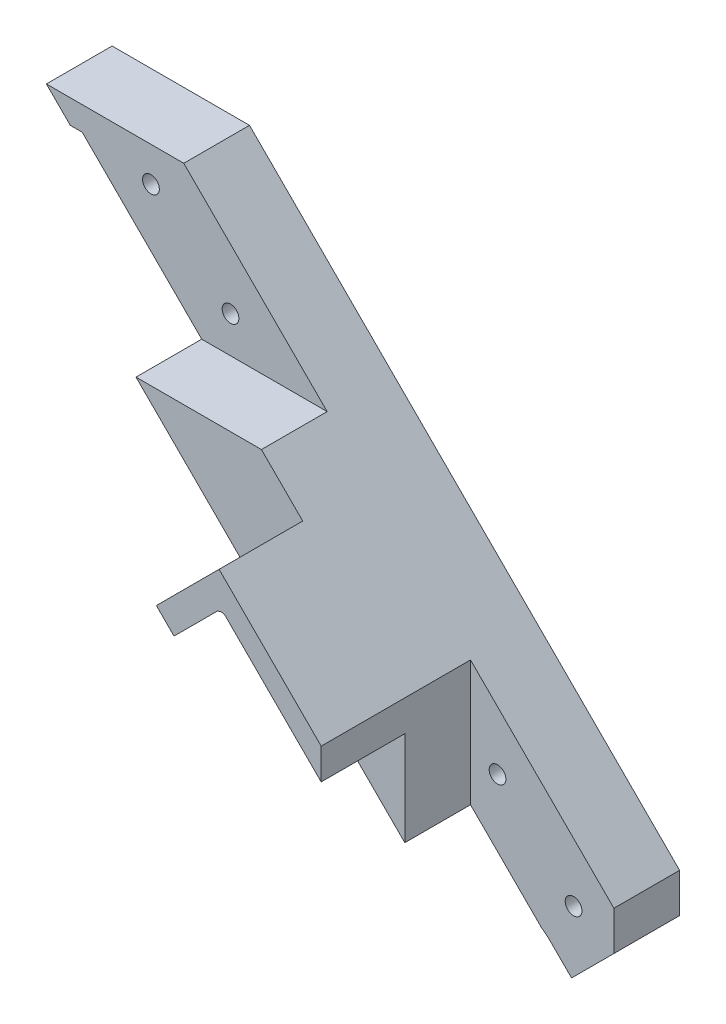
ISO-10303-21;
HEADER;
FILE_DESCRIPTION(('STEP AP214'),'2;1');
FILE_NAME('part.step','',(''),(''),'','','');
FILE_SCHEMA(('AUTOMOTIVE_DESIGN { 1 0 10303 214 1 1 1 1 }'));
ENDSEC;
DATA;
#1=APPLICATION_CONTEXT('core data for automotive mechanical design processes');
#2=APPLICATION_PROTOCOL_DEFINITION('international standard','automotive_design',2000,#1);
#3=PRODUCT_CONTEXT('',#1,'mechanical');
#4=PRODUCT('Part','Part','',(#3));
#5=PRODUCT_RELATED_PRODUCT_CATEGORY('part','',(#4));
#6=PRODUCT_DEFINITION_FORMATION('','',#4);
#7=PRODUCT_DEFINITION_CONTEXT('part definition',#1,'design');
#8=PRODUCT_DEFINITION('design','',#6,#7);
#9=PRODUCT_DEFINITION_SHAPE('','',#8);
#10=(LENGTH_UNIT() NAMED_UNIT(*) SI_UNIT(.MILLI.,.METRE.));
#11=(NAMED_UNIT(*) PLANE_ANGLE_UNIT() SI_UNIT($,.RADIAN.));
#12=(NAMED_UNIT(*) SI_UNIT($,.STERADIAN.) SOLID_ANGLE_UNIT());
#13=UNCERTAINTY_MEASURE_WITH_UNIT(LENGTH_MEASURE(1.E-05),#10,'distance_accuracy_value','');
#14=(GEOMETRIC_REPRESENTATION_CONTEXT(3) GLOBAL_UNCERTAINTY_ASSIGNED_CONTEXT((#13)) GLOBAL_UNIT_ASSIGNED_CONTEXT((#10,
#11,#12)) REPRESENTATION_CONTEXT('',''));
#15=CARTESIAN_POINT('',(0.,0.,0.));
#16=DIRECTION('',(0.,0.,1.));
#17=DIRECTION('',(1.,0.,0.));
#18=AXIS2_PLACEMENT_3D('',#15,#16,#17);
#19=CARTESIAN_POINT('',(-91.49539816056,-19.78969485403,41.));
#20=DIRECTION('',(0.,0.,1.));
#21=DIRECTION('',(1.,0.,0.));
#22=AXIS2_PLACEMENT_3D('',#19,#20,#21);
#23=PLANE('',#22);
#24=CARTESIAN_POINT('',(-91.49539816056,-19.78969485403,41.));
#25=DIRECTION('',(0.,0.,1.));
#26=DIRECTION('',(1.,0.,0.));
#27=AXIS2_PLACEMENT_3D('',#24,#25,#26);
#28=CIRCLE('',#27,1.4);
#29=CARTESIAN_POINT('',(-90.09539816056,-19.78969485403,41.));
#30=VERTEX_POINT('',#29);
#31=EDGE_CURVE('E9',#30,#30,#28,.T.);
#32=ORIENTED_EDGE('',*,*,#31,.T.);
#33=EDGE_LOOP('',(#32));
#34=FACE_BOUND('',#33,.T.);
#35=ADVANCED_FACE('F14',(#34),#23,.T.);
#36=CARTESIAN_POINT('',(-78.17647683943,-31.89780514596,41.));
#37=DIRECTION('',(0.,0.,1.));
#38=DIRECTION('',(1.,0.,0.));
#39=AXIS2_PLACEMENT_3D('',#36,#37,#38);
#40=PLANE('',#39);
#41=CARTESIAN_POINT('',(-78.17647683943,-31.89780514596,41.));
#42=DIRECTION('',(0.,0.,1.));
#43=DIRECTION('',(1.,0.,0.));
#44=AXIS2_PLACEMENT_3D('',#41,#42,#43);
#45=CIRCLE('',#44,1.4);
#46=CARTESIAN_POINT('',(-76.77647683943,-31.89780514596,41.));
#47=VERTEX_POINT('',#46);
#48=EDGE_CURVE('E488',#47,#47,#45,.T.);
#49=ORIENTED_EDGE('',*,*,#48,.T.);
#50=EDGE_LOOP('',(#49));
#51=FACE_BOUND('',#50,.T.);
#52=ADVANCED_FACE('F16',(#51),#40,.T.);
#53=CARTESIAN_POINT('',(-33.47902169813,-76.33683094573,41.));
#54=DIRECTION('',(0.,0.,1.));
#55=DIRECTION('',(1.,0.,0.));
#56=AXIS2_PLACEMENT_3D('',#53,#54,#55);
#57=PLANE('',#56);
#58=CARTESIAN_POINT('',(-33.47902169813,-76.33683094573,41.));
#59=DIRECTION('',(0.,0.,1.));
#60=DIRECTION('',(1.,0.,0.));
#61=AXIS2_PLACEMENT_3D('',#58,#59,#60);
#62=CIRCLE('',#61,1.4);
#63=CARTESIAN_POINT('',(-32.07902169813,-76.33683094573,41.));
#64=VERTEX_POINT('',#63);
#65=EDGE_CURVE('E305',#64,#64,#62,.T.);
#66=ORIENTED_EDGE('',*,*,#65,.T.);
#67=EDGE_LOOP('',(#66));
#68=FACE_BOUND('',#67,.T.);
#69=ADVANCED_FACE('F530',(#68),#57,.T.);
#70=CARTESIAN_POINT('',(-20.75109963677,-89.06475300708,41.));
#71=DIRECTION('',(0.,0.,1.));
#72=DIRECTION('',(1.,0.,0.));
#73=AXIS2_PLACEMENT_3D('',#70,#71,#72);
#74=PLANE('',#73);
#75=CARTESIAN_POINT('',(-20.75109963677,-89.06475300708,41.));
#76=DIRECTION('',(0.,0.,1.));
#77=DIRECTION('',(1.,0.,0.));
#78=AXIS2_PLACEMENT_3D('',#75,#76,#77);
#79=CIRCLE('',#78,1.4);
#80=CARTESIAN_POINT('',(-19.35109963677,-89.06475300708,41.));
#81=VERTEX_POINT('',#80);
#82=EDGE_CURVE('E430',#81,#81,#79,.T.);
#83=ORIENTED_EDGE('',*,*,#82,.T.);
#84=EDGE_LOOP('',(#83));
#85=FACE_BOUND('',#84,.T.);
#86=ADVANCED_FACE('F535',(#85),#74,.T.);
#87=CARTESIAN_POINT('',(-55.43717164502,-59.67981233214,43.9));
#88=DIRECTION('',(0.,0.,1.));
#89=DIRECTION('',(1.,0.,0.));
#90=AXIS2_PLACEMENT_3D('',#87,#88,#89);
#91=PLANE('',#90);
#92=CARTESIAN_POINT('',(-55.43717164502,-59.67981233214,43.9));
#93=DIRECTION('',(0.,0.,1.));
#94=DIRECTION('',(1.,0.,0.));
#95=AXIS2_PLACEMENT_3D('',#92,#93,#94);
#96=CIRCLE('',#95,1.7);
#97=CARTESIAN_POINT('',(-53.73717164502,-59.67981233214,43.9));
#98=VERTEX_POINT('',#97);
#99=EDGE_CURVE('E393',#98,#98,#96,.T.);
#100=ORIENTED_EDGE('',*,*,#99,.T.);
#101=EDGE_LOOP('',(#100));
#102=FACE_BOUND('',#101,.T.);
#103=CARTESIAN_POINT('',(-55.43717164502,-59.67981233214,43.9));
#104=DIRECTION('',(0.,0.,1.));
#105=DIRECTION('',(1.,0.,0.));
#106=AXIS2_PLACEMENT_3D('',#103,#104,#105);
#107=CIRCLE('',#106,3.6);
#108=CARTESIAN_POINT('',(-51.83717164502,-59.67981233214,43.9));
#109=VERTEX_POINT('',#108);
#110=EDGE_CURVE('E489',#109,#109,#107,.T.);
#111=ORIENTED_EDGE('',*,*,#110,.F.);
#112=EDGE_LOOP('',(#111));
#113=FACE_BOUND('',#112,.T.);
#114=ADVANCED_FACE('F539',(#102,#113),#91,.F.);
#115=CARTESIAN_POINT('',(-47.30544366138,-67.81154031579,43.9));
#116=DIRECTION('',(0.,0.,1.));
#117=DIRECTION('',(1.,0.,0.));
#118=AXIS2_PLACEMENT_3D('',#115,#116,#117);
#119=PLANE('',#118);
#120=CARTESIAN_POINT('',(-47.30544366138,-67.81154031579,43.9));
#121=DIRECTION('',(0.,0.,1.));
#122=DIRECTION('',(1.,0.,0.));
#123=AXIS2_PLACEMENT_3D('',#120,#121,#122);
#124=CIRCLE('',#123,1.7);
#125=CARTESIAN_POINT('',(-45.60544366138,-67.81154031579,43.9));
#126=VERTEX_POINT('',#125);
#127=EDGE_CURVE('E394',#126,#126,#124,.T.);
#128=ORIENTED_EDGE('',*,*,#127,.T.);
#129=EDGE_LOOP('',(#128));
#130=FACE_BOUND('',#129,.T.);
#131=CARTESIAN_POINT('',(-47.30544366138,-67.81154031579,43.9));
#132=DIRECTION('',(0.,0.,1.));
#133=DIRECTION('',(1.,0.,0.));
#134=AXIS2_PLACEMENT_3D('',#131,#132,#133);
#135=CIRCLE('',#134,3.6);
#136=CARTESIAN_POINT('',(-43.70544366138,-67.81154031579,43.9));
#137=VERTEX_POINT('',#136);
#138=EDGE_CURVE('E337',#137,#137,#135,.T.);
#139=ORIENTED_EDGE('',*,*,#138,.F.);
#140=EDGE_LOOP('',(#139));
#141=FACE_BOUND('',#140,.T.);
#142=ADVANCED_FACE('F541',(#130,#141),#119,.F.);
#143=CARTESIAN_POINT('',(-91.49539816056,-19.78969485403,41.));
#144=DIRECTION('',(0.,0.,1.));
#145=DIRECTION('',(1.,0.,0.));
#146=AXIS2_PLACEMENT_3D('',#143,#144,#145);
#147=CYLINDRICAL_SURFACE('',#146,1.4);
#148=DIRECTION('',(0.,0.,1.));
#149=VECTOR('',#148,1.);
#150=CARTESIAN_POINT('',(-90.09539816056,-19.78969485403,41.));
#151=LINE('',#150,#149);
#152=CARTESIAN_POINT('',(-90.09539816056,-19.78969485403,51.));
#153=VERTEX_POINT('',#152);
#154=EDGE_CURVE('E25',#30,#153,#151,.T.);
#155=ORIENTED_EDGE('',*,*,#154,.F.);
#156=ORIENTED_EDGE('',*,*,#31,.F.);
#157=ORIENTED_EDGE('',*,*,#154,.T.);
#158=CARTESIAN_POINT('',(-91.49539816056,-19.78969485403,51.));
#159=DIRECTION('',(0.,0.,1.));
#160=DIRECTION('',(1.,0.,0.));
#161=AXIS2_PLACEMENT_3D('',#158,#159,#160);
#162=CIRCLE('',#161,1.4);
#163=EDGE_CURVE('E629',#153,#153,#162,.T.);
#164=ORIENTED_EDGE('',*,*,#163,.T.);
#165=EDGE_LOOP('',(#155,#156,#157,#164));
#166=FACE_BOUND('',#165,.T.);
#167=ADVANCED_FACE('F544',(#166),#147,.F.);
#168=CARTESIAN_POINT('',(-78.17647683943,-31.89780514596,41.));
#169=DIRECTION('',(0.,0.,1.));
#170=DIRECTION('',(1.,0.,0.));
#171=AXIS2_PLACEMENT_3D('',#168,#169,#170);
#172=CYLINDRICAL_SURFACE('',#171,1.4);
#173=DIRECTION('',(0.,0.,1.));
#174=VECTOR('',#173,1.);
#175=CARTESIAN_POINT('',(-76.77647683943,-31.89780514596,41.));
#176=LINE('',#175,#174);
#177=CARTESIAN_POINT('',(-76.77647683943,-31.89780514596,51.));
#178=VERTEX_POINT('',#177);
#179=EDGE_CURVE('E485',#47,#178,#176,.T.);
#180=ORIENTED_EDGE('',*,*,#179,.F.);
#181=ORIENTED_EDGE('',*,*,#48,.F.);
#182=ORIENTED_EDGE('',*,*,#179,.T.);
#183=CARTESIAN_POINT('',(-78.17647683943,-31.89780514596,51.));
#184=DIRECTION('',(0.,0.,1.));
#185=DIRECTION('',(1.,0.,0.));
#186=AXIS2_PLACEMENT_3D('',#183,#184,#185);
#187=CIRCLE('',#186,1.4);
#188=EDGE_CURVE('E315',#178,#178,#187,.T.);
#189=ORIENTED_EDGE('',*,*,#188,.T.);
#190=EDGE_LOOP('',(#180,#181,#182,#189));
#191=FACE_BOUND('',#190,.T.);
#192=ADVANCED_FACE('F546',(#191),#172,.F.);
#193=CARTESIAN_POINT('',(-55.43717164502,-59.67981233214,39.9));
#194=DIRECTION('',(0.,0.,1.));
#195=DIRECTION('',(1.,0.,0.));
#196=AXIS2_PLACEMENT_3D('',#193,#194,#195);
#197=CYLINDRICAL_SURFACE('',#196,3.6);
#198=CARTESIAN_POINT('',(-55.43717164502,-59.67981233214,40.));
#199=DIRECTION('',(0.,0.,1.));
#200=DIRECTION('',(1.,0.,0.));
#201=AXIS2_PLACEMENT_3D('',#198,#199,#200);
#202=CIRCLE('',#201,3.6);
#203=CARTESIAN_POINT('',(-51.83717164502,-59.67981233214,40.));
#204=VERTEX_POINT('',#203);
#205=EDGE_CURVE('E617',#204,#204,#202,.T.);
#206=ORIENTED_EDGE('',*,*,#205,.F.);
#207=DIRECTION('',(0.,0.,1.));
#208=VECTOR('',#207,1.);
#209=CARTESIAN_POINT('',(-51.83717164502,-59.67981233214,39.9));
#210=LINE('',#209,#208);
#211=EDGE_CURVE('E340',#204,#109,#210,.T.);
#212=ORIENTED_EDGE('',*,*,#211,.T.);
#213=ORIENTED_EDGE('',*,*,#110,.T.);
#214=ORIENTED_EDGE('',*,*,#211,.F.);
#215=EDGE_LOOP('',(#206,#212,#213,#214));
#216=FACE_BOUND('',#215,.T.);
#217=ADVANCED_FACE('F549',(#216),#197,.F.);
#218=CARTESIAN_POINT('',(-47.30544366138,-67.81154031579,39.9));
#219=DIRECTION('',(0.,0.,1.));
#220=DIRECTION('',(1.,0.,0.));
#221=AXIS2_PLACEMENT_3D('',#218,#219,#220);
#222=CYLINDRICAL_SURFACE('',#221,3.6);
#223=CARTESIAN_POINT('',(-47.30544366138,-67.81154031579,40.));
#224=DIRECTION('',(0.,0.,1.));
#225=DIRECTION('',(1.,0.,0.));
#226=AXIS2_PLACEMENT_3D('',#223,#224,#225);
#227=CIRCLE('',#226,3.6);
#228=CARTESIAN_POINT('',(-43.70544366138,-67.81154031579,40.));
#229=VERTEX_POINT('',#228);
#230=EDGE_CURVE('E625',#229,#229,#227,.T.);
#231=ORIENTED_EDGE('',*,*,#230,.F.);
#232=DIRECTION('',(0.,0.,1.));
#233=VECTOR('',#232,1.);
#234=CARTESIAN_POINT('',(-43.70544366138,-67.81154031579,39.9));
#235=LINE('',#234,#233);
#236=EDGE_CURVE('E304',#229,#137,#235,.T.);
#237=ORIENTED_EDGE('',*,*,#236,.T.);
#238=ORIENTED_EDGE('',*,*,#138,.T.);
#239=ORIENTED_EDGE('',*,*,#236,.F.);
#240=EDGE_LOOP('',(#231,#237,#238,#239));
#241=FACE_BOUND('',#240,.T.);
#242=ADVANCED_FACE('F752',(#241),#222,.F.);
#243=CARTESIAN_POINT('',(-109.,-14.,40.));
#244=DIRECTION('',(0.707106781186548,0.707106781186548,0.));
#245=DIRECTION('',(0.,0.,-1.));
#246=AXIS2_PLACEMENT_3D('',#243,#244,#245);
#247=PLANE('',#246);
#248=DIRECTION('',(0.707106781186548,-0.707106781186548,0.));
#249=VECTOR('',#248,1.);
#250=CARTESIAN_POINT('',(-109.,-14.,40.));
#251=LINE('',#250,#249);
#252=CARTESIAN_POINT('',(-109.,-14.,40.));
#253=VERTEX_POINT('',#252);
#254=CARTESIAN_POINT('',(-105.,-18.,40.));
#255=VERTEX_POINT('',#254);
#256=EDGE_CURVE('E384',#253,#255,#251,.T.);
#257=ORIENTED_EDGE('',*,*,#256,.T.);
#258=DIRECTION('',(0.,0.,1.));
#259=VECTOR('',#258,1.);
#260=CARTESIAN_POINT('',(-105.,-18.,40.));
#261=LINE('',#260,#259);
#262=CARTESIAN_POINT('',(-105.,-18.,51.));
#263=VERTEX_POINT('',#262);
#264=EDGE_CURVE('E318',#255,#263,#261,.T.);
#265=ORIENTED_EDGE('',*,*,#264,.T.);
#266=DIRECTION('',(0.707106781186548,-0.707106781186548,0.));
#267=VECTOR('',#266,1.);
#268=CARTESIAN_POINT('',(-109.,-14.,51.));
#269=LINE('',#268,#267);
#270=CARTESIAN_POINT('',(-109.,-14.,51.));
#271=VERTEX_POINT('',#270);
#272=EDGE_CURVE('E310',#271,#263,#269,.T.);
#273=ORIENTED_EDGE('',*,*,#272,.F.);
#274=DIRECTION('',(0.,0.,1.));
#275=VECTOR('',#274,1.);
#276=CARTESIAN_POINT('',(-109.,-14.,40.));
#277=LINE('',#276,#275);
#278=EDGE_CURVE('E292',#253,#271,#277,.T.);
#279=ORIENTED_EDGE('',*,*,#278,.F.);
#280=EDGE_LOOP('',(#257,#265,#273,#279));
#281=FACE_BOUND('',#280,.T.);
#282=ADVANCED_FACE('F317',(#281),#247,.F.);
#283=CARTESIAN_POINT('',(-86.,-14.,40.));
#284=DIRECTION('',(0.,-1.,0.));
#285=DIRECTION('',(0.,0.,-1.));
#286=AXIS2_PLACEMENT_3D('',#283,#284,#285);
#287=PLANE('',#286);
#288=DIRECTION('',(-1.,0.,0.));
#289=VECTOR('',#288,1.);
#290=CARTESIAN_POINT('',(-86.,-14.,40.));
#291=LINE('',#290,#289);
#292=CARTESIAN_POINT('',(-86.,-14.,40.));
#293=VERTEX_POINT('',#292);
#294=EDGE_CURVE('E298',#293,#253,#291,.T.);
#295=ORIENTED_EDGE('',*,*,#294,.T.);
#296=ORIENTED_EDGE('',*,*,#278,.T.);
#297=DIRECTION('',(-1.,0.,0.));
#298=VECTOR('',#297,1.);
#299=CARTESIAN_POINT('',(-86.,-14.,51.));
#300=LINE('',#299,#298);
#301=CARTESIAN_POINT('',(-86.,-14.,51.));
#302=VERTEX_POINT('',#301);
#303=EDGE_CURVE('E295',#302,#271,#300,.T.);
#304=ORIENTED_EDGE('',*,*,#303,.F.);
#305=DIRECTION('',(0.,0.,1.));
#306=VECTOR('',#305,1.);
#307=CARTESIAN_POINT('',(-86.,-14.,40.));
#308=LINE('',#307,#306);
#309=EDGE_CURVE('E286',#293,#302,#308,.T.);
#310=ORIENTED_EDGE('',*,*,#309,.F.);
#311=EDGE_LOOP('',(#295,#296,#304,#310));
#312=FACE_BOUND('',#311,.T.);
#313=ADVANCED_FACE('F294',(#312),#287,.F.);
#314=CARTESIAN_POINT('',(-33.47902169813,-76.33683094573,41.));
#315=DIRECTION('',(0.,0.,1.));
#316=DIRECTION('',(1.,0.,0.));
#317=AXIS2_PLACEMENT_3D('',#314,#315,#316);
#318=CYLINDRICAL_SURFACE('',#317,1.4);
#319=DIRECTION('',(0.,0.,1.));
#320=VECTOR('',#319,1.);
#321=CARTESIAN_POINT('',(-32.07902169813,-76.33683094573,41.));
#322=LINE('',#321,#320);
#323=CARTESIAN_POINT('',(-32.07902169813,-76.33683094573,51.));
#324=VERTEX_POINT('',#323);
#325=EDGE_CURVE('E484',#64,#324,#322,.T.);
#326=ORIENTED_EDGE('',*,*,#325,.F.);
#327=ORIENTED_EDGE('',*,*,#65,.F.);
#328=ORIENTED_EDGE('',*,*,#325,.T.);
#329=CARTESIAN_POINT('',(-33.47902169813,-76.33683094573,51.));
#330=DIRECTION('',(0.,0.,1.));
#331=DIRECTION('',(1.,0.,0.));
#332=AXIS2_PLACEMENT_3D('',#329,#330,#331);
#333=CIRCLE('',#332,1.4);
#334=EDGE_CURVE('E470',#324,#324,#333,.T.);
#335=ORIENTED_EDGE('',*,*,#334,.T.);
#336=EDGE_LOOP('',(#326,#327,#328,#335));
#337=FACE_BOUND('',#336,.T.);
#338=ADVANCED_FACE('F555',(#337),#318,.F.);
#339=CARTESIAN_POINT('',(-20.75109963677,-89.06475300708,41.));
#340=DIRECTION('',(0.,0.,1.));
#341=DIRECTION('',(1.,0.,0.));
#342=AXIS2_PLACEMENT_3D('',#339,#340,#341);
#343=CYLINDRICAL_SURFACE('',#342,1.4);
#344=DIRECTION('',(0.,0.,1.));
#345=VECTOR('',#344,1.);
#346=CARTESIAN_POINT('',(-19.35109963677,-89.06475300708,41.));
#347=LINE('',#346,#345);
#348=CARTESIAN_POINT('',(-19.35109963677,-89.06475300708,51.));
#349=VERTEX_POINT('',#348);
#350=EDGE_CURVE('E427',#81,#349,#347,.T.);
#351=ORIENTED_EDGE('',*,*,#350,.F.);
#352=ORIENTED_EDGE('',*,*,#82,.F.);
#353=ORIENTED_EDGE('',*,*,#350,.T.);
#354=CARTESIAN_POINT('',(-20.75109963677,-89.06475300708,51.));
#355=DIRECTION('',(0.,0.,1.));
#356=DIRECTION('',(1.,0.,0.));
#357=AXIS2_PLACEMENT_3D('',#354,#355,#356);
#358=CIRCLE('',#357,1.4);
#359=EDGE_CURVE('E466',#349,#349,#358,.T.);
#360=ORIENTED_EDGE('',*,*,#359,.T.);
#361=EDGE_LOOP('',(#351,#352,#353,#360));
#362=FACE_BOUND('',#361,.T.);
#363=ADVANCED_FACE('F558',(#362),#343,.F.);
#364=CARTESIAN_POINT('',(-25.12003021328,-95.62906507217,40.));
#365=DIRECTION('',(0.706795959357822,0.707417466447822,0.));
#366=DIRECTION('',(0.,0.,-1.));
#367=AXIS2_PLACEMENT_3D('',#364,#365,#366);
#368=PLANE('',#367);
#369=DIRECTION('',(0.707417466447822,-0.706795959357822,0.));
#370=VECTOR('',#369,1.);
#371=CARTESIAN_POINT('',(-25.12003021328,-95.62906507217,40.));
#372=LINE('',#371,#370);
#373=CARTESIAN_POINT('',(-25.12003021328,-95.62906507217,40.));
#374=VERTEX_POINT('',#373);
#375=CARTESIAN_POINT('',(-21.08918523767,-99.65636871773,40.));
#376=VERTEX_POINT('',#375);
#377=EDGE_CURVE('E426',#374,#376,#372,.T.);
#378=ORIENTED_EDGE('',*,*,#377,.T.);
#379=DIRECTION('',(0.,0.,1.));
#380=VECTOR('',#379,1.);
#381=CARTESIAN_POINT('',(-21.08918523767,-99.65636871773,40.));
#382=LINE('',#381,#380);
#383=CARTESIAN_POINT('',(-21.08918523767,-99.65636871773,51.));
#384=VERTEX_POINT('',#383);
#385=EDGE_CURVE('E234',#376,#384,#382,.T.);
#386=ORIENTED_EDGE('',*,*,#385,.T.);
#387=DIRECTION('',(0.707417466447822,-0.706795959357822,0.));
#388=VECTOR('',#387,1.);
#389=CARTESIAN_POINT('',(-25.12003021328,-95.62906507217,51.));
#390=LINE('',#389,#388);
#391=CARTESIAN_POINT('',(-25.12003021328,-95.62906507217,51.));
#392=VERTEX_POINT('',#391);
#393=EDGE_CURVE('E385',#392,#384,#390,.T.);
#394=ORIENTED_EDGE('',*,*,#393,.F.);
#395=DIRECTION('',(0.,0.,1.));
#396=VECTOR('',#395,1.);
#397=CARTESIAN_POINT('',(-25.12003021328,-95.62906507217,40.));
#398=LINE('',#397,#396);
#399=EDGE_CURVE('E245',#374,#392,#398,.T.);
#400=ORIENTED_EDGE('',*,*,#399,.F.);
#401=EDGE_LOOP('',(#378,#386,#394,#400));
#402=FACE_BOUND('',#401,.T.);
#403=ADVANCED_FACE('F566',(#402),#368,.F.);
#404=CARTESIAN_POINT('',(-21.08918523767,-99.65636871773,40.));
#405=DIRECTION('',(-0.707029670829544,0.707183883135544,0.));
#406=DIRECTION('',(0.,0.,1.));
#407=AXIS2_PLACEMENT_3D('',#404,#405,#406);
#408=PLANE('',#407);
#409=DIRECTION('',(0.707183883135544,0.707029670829544,0.));
#410=VECTOR('',#409,1.);
#411=CARTESIAN_POINT('',(-21.08918523767,-99.65636871773,40.));
#412=LINE('',#411,#410);
#413=CARTESIAN_POINT('',(-14.,-92.56872938577,40.));
#414=VERTEX_POINT('',#413);
#415=EDGE_CURVE('E474',#376,#414,#412,.T.);
#416=ORIENTED_EDGE('',*,*,#415,.T.);
#417=DIRECTION('',(0.,0.,1.));
#418=VECTOR('',#417,1.);
#419=CARTESIAN_POINT('',(-14.,-92.56872938577,40.));
#420=LINE('',#419,#418);
#421=CARTESIAN_POINT('',(-14.,-92.56872938577,51.));
#422=VERTEX_POINT('',#421);
#423=EDGE_CURVE('E398',#414,#422,#420,.T.);
#424=ORIENTED_EDGE('',*,*,#423,.T.);
#425=DIRECTION('',(0.707183883135544,0.707029670829544,0.));
#426=VECTOR('',#425,1.);
#427=CARTESIAN_POINT('',(-21.08918523767,-99.65636871773,51.));
#428=LINE('',#427,#426);
#429=EDGE_CURVE('E389',#384,#422,#428,.T.);
#430=ORIENTED_EDGE('',*,*,#429,.F.);
#431=ORIENTED_EDGE('',*,*,#385,.F.);
#432=EDGE_LOOP('',(#416,#424,#430,#431));
#433=FACE_BOUND('',#432,.T.);
#434=ADVANCED_FACE('F568',(#433),#408,.F.);
#435=CARTESIAN_POINT('',(-14.,-92.56872938577,40.));
#436=DIRECTION('',(-1.,0.,0.));
#437=DIRECTION('',(0.,0.,1.));
#438=AXIS2_PLACEMENT_3D('',#435,#436,#437);
#439=PLANE('',#438);
#440=DIRECTION('',(0.,1.,0.));
#441=VECTOR('',#440,1.);
#442=CARTESIAN_POINT('',(-14.,-92.56872938577,40.));
#443=LINE('',#442,#441);
#444=CARTESIAN_POINT('',(-14.,-86.,40.));
#445=VERTEX_POINT('',#444);
#446=EDGE_CURVE('E447',#414,#445,#443,.T.);
#447=ORIENTED_EDGE('',*,*,#446,.T.);
#448=DIRECTION('',(0.,0.,1.));
#449=VECTOR('',#448,1.);
#450=CARTESIAN_POINT('',(-14.,-86.,40.));
#451=LINE('',#450,#449);
#452=CARTESIAN_POINT('',(-14.,-86.,51.));
#453=VERTEX_POINT('',#452);
#454=EDGE_CURVE('E647',#445,#453,#451,.T.);
#455=ORIENTED_EDGE('',*,*,#454,.T.);
#456=DIRECTION('',(0.,1.,0.));
#457=VECTOR('',#456,1.);
#458=CARTESIAN_POINT('',(-14.,-92.56872938577,51.));
#459=LINE('',#458,#457);
#460=EDGE_CURVE('E471',#422,#453,#459,.T.);
#461=ORIENTED_EDGE('',*,*,#460,.F.);
#462=ORIENTED_EDGE('',*,*,#423,.F.);
#463=EDGE_LOOP('',(#447,#455,#461,#462));
#464=FACE_BOUND('',#463,.T.);
#465=ADVANCED_FACE('F571',(#464),#439,.F.);
#466=CARTESIAN_POINT('',(-55.43717164502,-59.67981233214,39.9));
#467=DIRECTION('',(0.,0.,1.));
#468=DIRECTION('',(1.,0.,0.));
#469=AXIS2_PLACEMENT_3D('',#466,#467,#468);
#470=CYLINDRICAL_SURFACE('',#469,1.7);
#471=DIRECTION('',(0.,0.,1.));
#472=VECTOR('',#471,1.);
#473=CARTESIAN_POINT('',(-53.73717164502,-59.67981233214,39.9));
#474=LINE('',#473,#472);
#475=CARTESIAN_POINT('',(-53.73717164502,-59.67981233214,62.));
#476=VERTEX_POINT('',#475);
#477=EDGE_CURVE('E390',#98,#476,#474,.T.);
#478=ORIENTED_EDGE('',*,*,#477,.T.);
#479=CARTESIAN_POINT('',(-55.43717164502,-59.67981233214,62.));
#480=DIRECTION('',(0.,0.,1.));
#481=DIRECTION('',(1.,0.,0.));
#482=AXIS2_PLACEMENT_3D('',#479,#480,#481);
#483=CIRCLE('',#482,1.7);
#484=EDGE_CURVE('E336',#476,#476,#483,.T.);
#485=ORIENTED_EDGE('',*,*,#484,.T.);
#486=ORIENTED_EDGE('',*,*,#477,.F.);
#487=ORIENTED_EDGE('',*,*,#99,.F.);
#488=EDGE_LOOP('',(#478,#485,#486,#487));
#489=FACE_BOUND('',#488,.T.);
#490=ADVANCED_FACE('F699',(#489),#470,.F.);
#491=CARTESIAN_POINT('',(-47.30544366138,-67.81154031579,39.9));
#492=DIRECTION('',(0.,0.,1.));
#493=DIRECTION('',(1.,0.,0.));
#494=AXIS2_PLACEMENT_3D('',#491,#492,#493);
#495=CYLINDRICAL_SURFACE('',#494,1.7);
#496=DIRECTION('',(0.,0.,1.));
#497=VECTOR('',#496,1.);
#498=CARTESIAN_POINT('',(-45.60544366138,-67.81154031579,39.9));
#499=LINE('',#498,#497);
#500=CARTESIAN_POINT('',(-45.60544366138,-67.81154031579,62.));
#501=VERTEX_POINT('',#500);
#502=EDGE_CURVE('E353',#126,#501,#499,.T.);
#503=ORIENTED_EDGE('',*,*,#502,.T.);
#504=CARTESIAN_POINT('',(-47.30544366138,-67.81154031579,62.));
#505=DIRECTION('',(0.,0.,1.));
#506=DIRECTION('',(1.,0.,0.));
#507=AXIS2_PLACEMENT_3D('',#504,#505,#506);
#508=CIRCLE('',#507,1.7);
#509=EDGE_CURVE('E341',#501,#501,#508,.T.);
#510=ORIENTED_EDGE('',*,*,#509,.T.);
#511=ORIENTED_EDGE('',*,*,#502,.F.);
#512=ORIENTED_EDGE('',*,*,#127,.F.);
#513=EDGE_LOOP('',(#503,#510,#511,#512));
#514=FACE_BOUND('',#513,.T.);
#515=ADVANCED_FACE('F585',(#514),#495,.F.);
#516=CARTESIAN_POINT('',(-12.52303190724,-92.66617286206,60.));
#517=DIRECTION('',(-0.707106781186548,-0.707106781186548,0.));
#518=DIRECTION('',(-0.707106781186548,0.707106781186548,0.));
#519=AXIS2_PLACEMENT_3D('',#516,#517,#518);
#520=PLANE('',#519);
#521=DIRECTION('',(-0.707106781186548,0.707106781186548,0.));
#522=VECTOR('',#521,1.);
#523=CARTESIAN_POINT('',(-35.10440155822,-70.08480321108,62.));
#524=LINE('',#523,#522);
#525=CARTESIAN_POINT('',(-38.,-67.18920476931,62.));
#526=VERTEX_POINT('',#525);
#527=CARTESIAN_POINT('',(-54.00881594702,-51.18038882228,62.));
#528=VERTEX_POINT('',#527);
#529=EDGE_CURVE('E416',#526,#528,#524,.T.);
#530=ORIENTED_EDGE('',*,*,#529,.F.);
#531=DIRECTION('',(0.,0.,-1.));
#532=VECTOR('',#531,1.);
#533=CARTESIAN_POINT('',(-38.,-67.18920476931,60.5));
#534=LINE('',#533,#532);
#535=CARTESIAN_POINT('',(-38.,-67.18920476931,76.));
#536=VERTEX_POINT('',#535);
#537=EDGE_CURVE('E149',#536,#526,#534,.T.);
#538=ORIENTED_EDGE('',*,*,#537,.F.);
#539=DIRECTION('',(-0.707106781186548,0.707106781186548,0.));
#540=VECTOR('',#539,1.);
#541=CARTESIAN_POINT('',(-35.10440155822,-70.08480321108,76.));
#542=LINE('',#541,#540);
#543=CARTESIAN_POINT('',(-54.00881594702,-51.18038882228,76.));
#544=VERTEX_POINT('',#543);
#545=EDGE_CURVE('E360',#536,#544,#542,.T.);
#546=ORIENTED_EDGE('',*,*,#545,.T.);
#547=DIRECTION('',(0.,0.,1.));
#548=VECTOR('',#547,1.);
#549=CARTESIAN_POINT('',(-54.00881594702,-51.18038882228,60.));
#550=LINE('',#549,#548);
#551=EDGE_CURVE('E132',#528,#544,#550,.T.);
#552=ORIENTED_EDGE('',*,*,#551,.F.);
#553=EDGE_LOOP('',(#530,#538,#546,#552));
#554=FACE_BOUND('',#553,.T.);
#555=ADVANCED_FACE('F582',(#554),#520,.T.);
#556=CARTESIAN_POINT('',(-54.00881594702,-51.18038882228,60.));
#557=DIRECTION('',(-0.575863900041016,-0.817545575873022,0.));
#558=DIRECTION('',(-0.817545575873022,0.575863900041016,0.));
#559=AXIS2_PLACEMENT_3D('',#556,#557,#558);
#560=PLANE('',#559);
#561=DIRECTION('',(-0.817545575873022,0.575863900041016,0.));
#562=VECTOR('',#561,1.);
#563=CARTESIAN_POINT('',(-56.16044792752,-49.66481926835,62.));
#564=LINE('',#563,#562);
#565=CARTESIAN_POINT('',(-54.29394835594,-50.97954685594,62.));
#566=VERTEX_POINT('',#565);
#567=EDGE_CURVE('E459',#528,#566,#564,.T.);
#568=ORIENTED_EDGE('',*,*,#567,.F.);
#569=ORIENTED_EDGE('',*,*,#551,.T.);
#570=DIRECTION('',(-0.817545575873022,0.575863900041016,0.));
#571=VECTOR('',#570,1.);
#572=CARTESIAN_POINT('',(-56.16044792752,-49.66481926835,76.));
#573=LINE('',#572,#571);
#574=CARTESIAN_POINT('',(-54.29394835594,-50.97954685594,76.));
#575=VERTEX_POINT('',#574);
#576=EDGE_CURVE('E397',#544,#575,#573,.T.);
#577=ORIENTED_EDGE('',*,*,#576,.T.);
#578=DIRECTION('',(0.,0.,1.));
#579=VECTOR('',#578,1.);
#580=CARTESIAN_POINT('',(-54.29394835594,-50.97954685594,60.));
#581=LINE('',#580,#579);
#582=EDGE_CURVE('E354',#566,#575,#581,.T.);
#583=ORIENTED_EDGE('',*,*,#582,.F.);
#584=EDGE_LOOP('',(#568,#569,#577,#583));
#585=FACE_BOUND('',#584,.T.);
#586=ADVANCED_FACE('F584',(#585),#560,.T.);
#587=CARTESIAN_POINT('',(-54.29394835594,-50.97954685594,60.));
#588=DIRECTION('',(-0.146730474453997,-0.989176509964983,0.));
#589=DIRECTION('',(-0.989176509964983,0.146730474453997,0.));
#590=AXIS2_PLACEMENT_3D('',#587,#588,#589);
#591=PLANE('',#590);
#592=DIRECTION('',(-0.989176509964983,0.146730474453997,0.));
#593=VECTOR('',#592,1.);
#594=CARTESIAN_POINT('',(-56.44720592198,-50.66014126846,62.));
#595=LINE('',#594,#593);
#596=CARTESIAN_POINT('',(-54.87973348691,-50.89265384006,62.));
#597=VERTEX_POINT('',#596);
#598=EDGE_CURVE('E463',#566,#597,#595,.T.);
#599=ORIENTED_EDGE('',*,*,#598,.F.);
#600=ORIENTED_EDGE('',*,*,#582,.T.);
#601=DIRECTION('',(-0.989176509964983,0.146730474453997,0.));
#602=VECTOR('',#601,1.);
#603=CARTESIAN_POINT('',(-56.44720592198,-50.66014126846,76.));
#604=LINE('',#603,#602);
#605=CARTESIAN_POINT('',(-54.87973348691,-50.89265384006,76.));
#606=VERTEX_POINT('',#605);
#607=EDGE_CURVE('E406',#575,#606,#604,.T.);
#608=ORIENTED_EDGE('',*,*,#607,.T.);
#609=DIRECTION('',(0.,0.,1.));
#610=VECTOR('',#609,1.);
#611=CARTESIAN_POINT('',(-54.87973348691,-50.89265384006,60.));
#612=LINE('',#611,#610);
#613=EDGE_CURVE('E18',#597,#606,#612,.T.);
#614=ORIENTED_EDGE('',*,*,#613,.F.);
#615=EDGE_LOOP('',(#599,#600,#608,#614));
#616=FACE_BOUND('',#615,.T.);
#617=ADVANCED_FACE('F589',(#616),#591,.T.);
#618=CARTESIAN_POINT('',(-54.87973348691,-50.89265384006,60.));
#619=DIRECTION('',(0.428059522707111,-0.903750543579234,0.));
#620=DIRECTION('',(0.,0.,-1.));
#621=AXIS2_PLACEMENT_3D('',#618,#619,#620);
#622=PLANE('',#621);
#623=DIRECTION('',(-0.903750543579234,-0.428059522707111,0.));
#624=VECTOR('',#623,1.);
#625=CARTESIAN_POINT('',(-55.719042226,-51.29019063914,62.));
#626=LINE('',#625,#624);
#627=CARTESIAN_POINT('',(-55.41576595431,-51.14654447811,62.));
#628=VERTEX_POINT('',#627);
#629=EDGE_CURVE('E345',#597,#628,#626,.T.);
#630=ORIENTED_EDGE('',*,*,#629,.F.);
#631=ORIENTED_EDGE('',*,*,#613,.T.);
#632=DIRECTION('',(-0.903750543579234,-0.428059522707111,0.));
#633=VECTOR('',#632,1.);
#634=CARTESIAN_POINT('',(-55.719042226,-51.29019063914,76.));
#635=LINE('',#634,#633);
#636=CARTESIAN_POINT('',(-55.41576595431,-51.14654447811,76.));
#637=VERTEX_POINT('',#636);
#638=EDGE_CURVE('E374',#606,#637,#635,.T.);
#639=ORIENTED_EDGE('',*,*,#638,.T.);
#640=DIRECTION('',(0.,0.,1.));
#641=VECTOR('',#640,1.);
#642=CARTESIAN_POINT('',(-55.41576595431,-51.14654447811,60.));
#643=LINE('',#642,#641);
#644=EDGE_CURVE('E367',#628,#637,#643,.T.);
#645=ORIENTED_EDGE('',*,*,#644,.F.);
#646=EDGE_LOOP('',(#630,#631,#639,#645));
#647=FACE_BOUND('',#646,.T.);
#648=ADVANCED_FACE('F563',(#647),#622,.T.);
#649=CARTESIAN_POINT('',(-38.,-62.,40.));
#650=DIRECTION('',(-0.707106781186548,-0.707106781186548,0.));
#651=DIRECTION('',(-0.707106781186548,0.707106781186548,0.));
#652=AXIS2_PLACEMENT_3D('',#649,#650,#651);
#653=PLANE('',#652);
#654=DIRECTION('',(-0.707106781186548,0.707106781186548,0.));
#655=VECTOR('',#654,1.);
#656=CARTESIAN_POINT('',(-14.,-86.,51.));
#657=LINE('',#656,#655);
#658=CARTESIAN_POINT('',(-38.,-62.,51.));
#659=VERTEX_POINT('',#658);
#660=EDGE_CURVE('E644',#453,#659,#657,.T.);
#661=ORIENTED_EDGE('',*,*,#660,.F.);
#662=ORIENTED_EDGE('',*,*,#454,.F.);
#663=DIRECTION('',(0.707106781186548,-0.707106781186548,0.));
#664=VECTOR('',#663,1.);
#665=CARTESIAN_POINT('',(-86.,-14.,40.));
#666=LINE('',#665,#664);
#667=EDGE_CURVE('E383',#293,#445,#666,.T.);
#668=ORIENTED_EDGE('',*,*,#667,.F.);
#669=ORIENTED_EDGE('',*,*,#309,.T.);
#670=DIRECTION('',(-0.707106781186548,0.707106781186548,0.));
#671=VECTOR('',#670,1.);
#672=CARTESIAN_POINT('',(-62.,-38.,51.));
#673=LINE('',#672,#671);
#674=CARTESIAN_POINT('',(-62.,-38.,51.));
#675=VERTEX_POINT('',#674);
#676=EDGE_CURVE('E313',#675,#302,#673,.T.);
#677=ORIENTED_EDGE('',*,*,#676,.F.);
#678=DIRECTION('',(0.,0.,1.));
#679=VECTOR('',#678,1.);
#680=CARTESIAN_POINT('',(-62.,-38.,40.));
#681=LINE('',#680,#679);
#682=CARTESIAN_POINT('',(-62.,-38.,62.));
#683=VERTEX_POINT('',#682);
#684=EDGE_CURVE('E620',#675,#683,#681,.T.);
#685=ORIENTED_EDGE('',*,*,#684,.T.);
#686=DIRECTION('',(-0.707106781186548,0.707106781186548,0.));
#687=VECTOR('',#686,1.);
#688=CARTESIAN_POINT('',(-38.,-62.,62.));
#689=LINE('',#688,#687);
#690=CARTESIAN_POINT('',(-55.09116882454,-44.90883117545,62.));
#691=VERTEX_POINT('',#690);
#692=EDGE_CURVE('E438',#691,#683,#689,.T.);
#693=ORIENTED_EDGE('',*,*,#692,.F.);
#694=DIRECTION('',(0.,0.,1.));
#695=VECTOR('',#694,1.);
#696=CARTESIAN_POINT('',(-55.09116882454,-44.90883117545,61.5));
#697=LINE('',#696,#695);
#698=CARTESIAN_POINT('',(-55.09116882454,-44.90883117545,76.));
#699=VERTEX_POINT('',#698);
#700=EDGE_CURVE('E346',#691,#699,#697,.T.);
#701=ORIENTED_EDGE('',*,*,#700,.T.);
#702=DIRECTION('',(-0.707106781186548,0.707106781186548,0.));
#703=VECTOR('',#702,1.);
#704=CARTESIAN_POINT('',(-46.54558441227,-53.45441558772,76.));
#705=LINE('',#704,#703);
#706=CARTESIAN_POINT('',(-38.,-62.,76.));
#707=VERTEX_POINT('',#706);
#708=EDGE_CURVE('E359',#707,#699,#705,.T.);
#709=ORIENTED_EDGE('',*,*,#708,.F.);
#710=DIRECTION('',(0.,0.,1.));
#711=VECTOR('',#710,1.);
#712=CARTESIAN_POINT('',(-38.,-62.,51.));
#713=LINE('',#712,#711);
#714=EDGE_CURVE('E333',#659,#707,#713,.T.);
#715=ORIENTED_EDGE('',*,*,#714,.F.);
#716=EDGE_LOOP('',(#661,#662,#668,#669,#677,#685,#693,#701,#709,#715));
#717=FACE_BOUND('',#716,.T.);
#718=ADVANCED_FACE('F560',(#717),#653,.F.);
#719=CARTESIAN_POINT('',(-85.35451163504,-25.64876001614,51.));
#720=DIRECTION('',(0.,0.,1.));
#721=DIRECTION('',(1.,0.,0.));
#722=AXIS2_PLACEMENT_3D('',#719,#720,#721);
#723=PLANE('',#722);
#724=ORIENTED_EDGE('',*,*,#163,.F.);
#725=EDGE_LOOP('',(#724));
#726=FACE_BOUND('',#725,.T.);
#727=ORIENTED_EDGE('',*,*,#188,.F.);
#728=EDGE_LOOP('',(#727));
#729=FACE_BOUND('',#728,.T.);
#730=ORIENTED_EDGE('',*,*,#272,.T.);
#731=DIRECTION('',(1.,0.,0.));
#732=VECTOR('',#731,1.);
#733=CARTESIAN_POINT('',(-105.,-18.,51.));
#734=LINE('',#733,#732);
#735=CARTESIAN_POINT('',(-103.,-18.,51.));
#736=VERTEX_POINT('',#735);
#737=EDGE_CURVE('E327',#263,#736,#734,.T.);
#738=ORIENTED_EDGE('',*,*,#737,.T.);
#739=DIRECTION('',(0.707106781186548,-0.707106781186548,0.));
#740=VECTOR('',#739,1.);
#741=CARTESIAN_POINT('',(-103.,-18.,51.));
#742=LINE('',#741,#740);
#743=CARTESIAN_POINT('',(-83.,-38.,51.));
#744=VERTEX_POINT('',#743);
#745=EDGE_CURVE('E366',#736,#744,#742,.T.);
#746=ORIENTED_EDGE('',*,*,#745,.T.);
#747=DIRECTION('',(1.,0.,0.));
#748=VECTOR('',#747,1.);
#749=CARTESIAN_POINT('',(-83.,-38.,51.));
#750=LINE('',#749,#748);
#751=EDGE_CURVE('E444',#744,#675,#750,.T.);
#752=ORIENTED_EDGE('',*,*,#751,.T.);
#753=ORIENTED_EDGE('',*,*,#676,.T.);
#754=ORIENTED_EDGE('',*,*,#303,.T.);
#755=EDGE_LOOP('',(#730,#738,#746,#752,#753,#754));
#756=FACE_BOUND('',#755,.T.);
#757=ADVANCED_FACE('F308',(#726,#729,#756),#723,.T.);
#758=CARTESIAN_POINT('',(-105.,-18.,40.));
#759=DIRECTION('',(0.,1.,0.));
#760=DIRECTION('',(1.,0.,0.));
#761=AXIS2_PLACEMENT_3D('',#758,#759,#760);
#762=PLANE('',#761);
#763=DIRECTION('',(1.,0.,0.));
#764=VECTOR('',#763,1.);
#765=CARTESIAN_POINT('',(-105.,-18.,40.));
#766=LINE('',#765,#764);
#767=CARTESIAN_POINT('',(-103.,-18.,40.));
#768=VERTEX_POINT('',#767);
#769=EDGE_CURVE('E423',#255,#768,#766,.T.);
#770=ORIENTED_EDGE('',*,*,#769,.T.);
#771=DIRECTION('',(0.,0.,1.));
#772=VECTOR('',#771,1.);
#773=CARTESIAN_POINT('',(-103.,-18.,40.));
#774=LINE('',#773,#772);
#775=EDGE_CURVE('E361',#768,#736,#774,.T.);
#776=ORIENTED_EDGE('',*,*,#775,.T.);
#777=ORIENTED_EDGE('',*,*,#737,.F.);
#778=ORIENTED_EDGE('',*,*,#264,.F.);
#779=EDGE_LOOP('',(#770,#776,#777,#778));
#780=FACE_BOUND('',#779,.T.);
#781=ADVANCED_FACE('F594',(#780),#762,.F.);
#782=CARTESIAN_POINT('',(-56.36703842477,-56.36703842477,40.));
#783=DIRECTION('',(0.,0.,1.));
#784=DIRECTION('',(1.,0.,0.));
#785=AXIS2_PLACEMENT_3D('',#782,#783,#784);
#786=PLANE('',#785);
#787=ORIENTED_EDGE('',*,*,#205,.T.);
#788=EDGE_LOOP('',(#787));
#789=FACE_BOUND('',#788,.T.);
#790=ORIENTED_EDGE('',*,*,#230,.T.);
#791=EDGE_LOOP('',(#790));
#792=FACE_BOUND('',#791,.T.);
#793=ORIENTED_EDGE('',*,*,#446,.F.);
#794=ORIENTED_EDGE('',*,*,#415,.F.);
#795=ORIENTED_EDGE('',*,*,#377,.F.);
#796=DIRECTION('',(0.798434914371271,-0.602081130341204,0.));
#797=VECTOR('',#796,1.);
#798=CARTESIAN_POINT('',(-26.14028599931,-94.85971400068,40.));
#799=LINE('',#798,#797);
#800=CARTESIAN_POINT('',(-26.14028599931,-94.85971400068,40.));
#801=VERTEX_POINT('',#800);
#802=EDGE_CURVE('E448',#801,#374,#799,.T.);
#803=ORIENTED_EDGE('',*,*,#802,.F.);
#804=DIRECTION('',(0.707106781186548,-0.707106781186548,0.));
#805=VECTOR('',#804,1.);
#806=CARTESIAN_POINT('',(-103.,-18.,40.));
#807=LINE('',#806,#805);
#808=EDGE_CURVE('E365',#768,#801,#807,.T.);
#809=ORIENTED_EDGE('',*,*,#808,.F.);
#810=ORIENTED_EDGE('',*,*,#769,.F.);
#811=ORIENTED_EDGE('',*,*,#256,.F.);
#812=ORIENTED_EDGE('',*,*,#294,.F.);
#813=ORIENTED_EDGE('',*,*,#667,.T.);
#814=EDGE_LOOP('',(#793,#794,#795,#803,#809,#810,#811,#812,#813));
#815=FACE_BOUND('',#814,.T.);
#816=ADVANCED_FACE('F577',(#789,#792,#815),#786,.F.);
#817=CARTESIAN_POINT('',(-26.14028599931,-94.85971400068,40.));
#818=DIRECTION('',(0.602081130341204,0.798434914371271,0.));
#819=DIRECTION('',(0.,0.,-1.));
#820=AXIS2_PLACEMENT_3D('',#817,#818,#819);
#821=PLANE('',#820);
#822=ORIENTED_EDGE('',*,*,#802,.T.);
#823=ORIENTED_EDGE('',*,*,#399,.T.);
#824=DIRECTION('',(0.798434914371271,-0.602081130341204,0.));
#825=VECTOR('',#824,1.);
#826=CARTESIAN_POINT('',(-26.14028599931,-94.85971400068,51.));
#827=LINE('',#826,#825);
#828=CARTESIAN_POINT('',(-26.14028599931,-94.85971400068,51.));
#829=VERTEX_POINT('',#828);
#830=EDGE_CURVE('E330',#829,#392,#827,.T.);
#831=ORIENTED_EDGE('',*,*,#830,.F.);
#832=DIRECTION('',(0.,0.,1.));
#833=VECTOR('',#832,1.);
#834=CARTESIAN_POINT('',(-26.14028599931,-94.85971400068,40.));
#835=LINE('',#834,#833);
#836=EDGE_CURVE('E431',#801,#829,#835,.T.);
#837=ORIENTED_EDGE('',*,*,#836,.F.);
#838=EDGE_LOOP('',(#822,#823,#831,#837));
#839=FACE_BOUND('',#838,.T.);
#840=ADVANCED_FACE('F573',(#839),#821,.F.);
#841=CARTESIAN_POINT('',(-27.81830935485,-81.37633885968,51.));
#842=DIRECTION('',(0.,0.,1.));
#843=DIRECTION('',(1.,0.,0.));
#844=AXIS2_PLACEMENT_3D('',#841,#842,#843);
#845=PLANE('',#844);
#846=ORIENTED_EDGE('',*,*,#334,.F.);
#847=EDGE_LOOP('',(#846));
#848=FACE_BOUND('',#847,.T.);
#849=ORIENTED_EDGE('',*,*,#359,.F.);
#850=EDGE_LOOP('',(#849));
#851=FACE_BOUND('',#850,.T.);
#852=ORIENTED_EDGE('',*,*,#660,.T.);
#853=DIRECTION('',(0.,-1.,0.));
#854=VECTOR('',#853,1.);
#855=CARTESIAN_POINT('',(-38.,-62.,51.));
#856=LINE('',#855,#854);
#857=CARTESIAN_POINT('',(-38.,-83.,51.));
#858=VERTEX_POINT('',#857);
#859=EDGE_CURVE('E412',#659,#858,#856,.T.);
#860=ORIENTED_EDGE('',*,*,#859,.T.);
#861=DIRECTION('',(0.707106781186548,-0.707106781186548,0.));
#862=VECTOR('',#861,1.);
#863=CARTESIAN_POINT('',(-38.,-83.,51.));
#864=LINE('',#863,#862);
#865=EDGE_CURVE('E435',#858,#829,#864,.T.);
#866=ORIENTED_EDGE('',*,*,#865,.T.);
#867=ORIENTED_EDGE('',*,*,#830,.T.);
#868=ORIENTED_EDGE('',*,*,#393,.T.);
#869=ORIENTED_EDGE('',*,*,#429,.T.);
#870=ORIENTED_EDGE('',*,*,#460,.T.);
#871=EDGE_LOOP('',(#852,#860,#866,#867,#868,#869,#870));
#872=FACE_BOUND('',#871,.T.);
#873=ADVANCED_FACE('F576',(#848,#851,#872),#845,.T.);
#874=CARTESIAN_POINT('',(-38.,-83.,40.));
#875=DIRECTION('',(-1.,0.,0.));
#876=DIRECTION('',(0.,0.,1.));
#877=AXIS2_PLACEMENT_3D('',#874,#875,#876);
#878=PLANE('',#877);
#879=ORIENTED_EDGE('',*,*,#714,.T.);
#880=DIRECTION('',(0.,1.,0.));
#881=VECTOR('',#880,1.);
#882=CARTESIAN_POINT('',(-38.,-65.54163056034,76.));
#883=LINE('',#882,#881);
#884=EDGE_CURVE('E355',#536,#707,#883,.T.);
#885=ORIENTED_EDGE('',*,*,#884,.F.);
#886=ORIENTED_EDGE('',*,*,#537,.T.);
#887=DIRECTION('',(0.,1.,0.));
#888=VECTOR('',#887,1.);
#889=CARTESIAN_POINT('',(-38.,-83.,62.));
#890=LINE('',#889,#888);
#891=CARTESIAN_POINT('',(-38.,-83.,62.));
#892=VERTEX_POINT('',#891);
#893=EDGE_CURVE('E370',#892,#526,#890,.T.);
#894=ORIENTED_EDGE('',*,*,#893,.F.);
#895=DIRECTION('',(0.,0.,1.));
#896=VECTOR('',#895,1.);
#897=CARTESIAN_POINT('',(-38.,-83.,40.));
#898=LINE('',#897,#896);
#899=EDGE_CURVE('E380',#858,#892,#898,.T.);
#900=ORIENTED_EDGE('',*,*,#899,.F.);
#901=ORIENTED_EDGE('',*,*,#859,.F.);
#902=EDGE_LOOP('',(#879,#885,#886,#894,#900,#901));
#903=FACE_BOUND('',#902,.T.);
#904=ADVANCED_FACE('F553',(#903),#878,.F.);
#905=CARTESIAN_POINT('',(-56.36703842477,-56.36703842477,62.));
#906=DIRECTION('',(0.,0.,1.));
#907=DIRECTION('',(1.,0.,0.));
#908=AXIS2_PLACEMENT_3D('',#905,#906,#907);
#909=PLANE('',#908);
#910=ORIENTED_EDGE('',*,*,#484,.F.);
#911=EDGE_LOOP('',(#910));
#912=FACE_BOUND('',#911,.T.);
#913=ORIENTED_EDGE('',*,*,#509,.F.);
#914=EDGE_LOOP('',(#913));
#915=FACE_BOUND('',#914,.T.);
#916=DIRECTION('',(-0.707149518526953,-0.707064041262953,0.));
#917=VECTOR('',#916,1.);
#918=CARTESIAN_POINT('',(-55.36248944857,-51.09327441221,62.));
#919=LINE('',#918,#917);
#920=CARTESIAN_POINT('',(-62.63504705628,-58.36495294371,62.));
#921=VERTEX_POINT('',#920);
#922=EDGE_CURVE('E371',#628,#921,#919,.T.);
#923=ORIENTED_EDGE('',*,*,#922,.T.);
#924=DIRECTION('',(0.707106781186548,-0.707106781186548,0.));
#925=VECTOR('',#924,1.);
#926=CARTESIAN_POINT('',(-83.,-38.,62.));
#927=LINE('',#926,#925);
#928=EDGE_CURVE('E375',#921,#892,#927,.T.);
#929=ORIENTED_EDGE('',*,*,#928,.T.);
#930=ORIENTED_EDGE('',*,*,#893,.T.);
#931=ORIENTED_EDGE('',*,*,#529,.T.);
#932=ORIENTED_EDGE('',*,*,#567,.T.);
#933=ORIENTED_EDGE('',*,*,#598,.T.);
#934=ORIENTED_EDGE('',*,*,#629,.T.);
#935=EDGE_LOOP('',(#923,#929,#930,#931,#932,#933,#934));
#936=FACE_BOUND('',#935,.T.);
#937=ADVANCED_FACE('F523',(#912,#915,#936),#909,.T.);
#938=CARTESIAN_POINT('',(-55.41576595431,-51.14654447811,60.));
#939=DIRECTION('',(0.707064041262953,-0.707149518526953,0.));
#940=DIRECTION('',(0.,0.,-1.));
#941=AXIS2_PLACEMENT_3D('',#938,#939,#940);
#942=PLANE('',#941);
#943=ORIENTED_EDGE('',*,*,#922,.F.);
#944=ORIENTED_EDGE('',*,*,#644,.T.);
#945=DIRECTION('',(-0.707149518526953,-0.707064041262953,0.));
#946=VECTOR('',#945,1.);
#947=CARTESIAN_POINT('',(-55.36248944857,-51.09327441221,76.));
#948=LINE('',#947,#946);
#949=CARTESIAN_POINT('',(-62.63504705628,-58.36495294371,76.));
#950=VERTEX_POINT('',#949);
#951=EDGE_CURVE('E350',#637,#950,#948,.T.);
#952=ORIENTED_EDGE('',*,*,#951,.T.);
#953=DIRECTION('',(0.,0.,1.));
#954=VECTOR('',#953,1.);
#955=CARTESIAN_POINT('',(-62.63504705628,-58.36495294371,60.5));
#956=LINE('',#955,#954);
#957=EDGE_CURVE('E379',#921,#950,#956,.T.);
#958=ORIENTED_EDGE('',*,*,#957,.F.);
#959=EDGE_LOOP('',(#943,#944,#952,#958));
#960=FACE_BOUND('',#959,.T.);
#961=ADVANCED_FACE('F508',(#960),#942,.T.);
#962=CARTESIAN_POINT('',(-58.26559876977,-48.08326112068,76.));
#963=DIRECTION('',(0.,0.,1.));
#964=DIRECTION('',(1.,0.,0.));
#965=AXIS2_PLACEMENT_3D('',#962,#963,#964);
#966=PLANE('',#965);
#967=ORIENTED_EDGE('',*,*,#951,.F.);
#968=ORIENTED_EDGE('',*,*,#638,.F.);
#969=ORIENTED_EDGE('',*,*,#607,.F.);
#970=ORIENTED_EDGE('',*,*,#576,.F.);
#971=ORIENTED_EDGE('',*,*,#545,.F.);
#972=ORIENTED_EDGE('',*,*,#884,.T.);
#973=ORIENTED_EDGE('',*,*,#708,.T.);
#974=DIRECTION('',(0.707106781186548,0.707106781186548,0.));
#975=VECTOR('',#974,1.);
#976=CARTESIAN_POINT('',(-66.89230150024,-56.70996385116,76.));
#977=LINE('',#976,#975);
#978=CARTESIAN_POINT('',(-65.59116882454,-55.40883117545,76.));
#979=VERTEX_POINT('',#978);
#980=EDGE_CURVE('E197',#979,#699,#977,.T.);
#981=ORIENTED_EDGE('',*,*,#980,.F.);
#982=DIRECTION('',(0.707106781186548,-0.707106781186548,0.));
#983=VECTOR('',#982,1.);
#984=CARTESIAN_POINT('',(-74.29558441227,-46.70441558772,76.));
#985=LINE('',#984,#983);
#986=EDGE_CURVE('E417',#979,#950,#985,.T.);
#987=ORIENTED_EDGE('',*,*,#986,.T.);
#988=EDGE_LOOP('',(#967,#968,#969,#970,#971,#972,#973,#981,#987));
#989=FACE_BOUND('',#988,.T.);
#990=ADVANCED_FACE('F512',(#989),#966,.T.);
#991=CARTESIAN_POINT('',(-58.26559876977,-48.08326112068,62.));
#992=DIRECTION('',(0.707106781186548,-0.707106781186548,0.));
#993=DIRECTION('',(0.,0.,-1.));
#994=AXIS2_PLACEMENT_3D('',#991,#992,#993);
#995=PLANE('',#994);
#996=DIRECTION('',(0.707106781186548,0.707106781186548,0.));
#997=VECTOR('',#996,1.);
#998=CARTESIAN_POINT('',(-66.89230150024,-56.70996385116,62.));
#999=LINE('',#998,#997);
#1000=CARTESIAN_POINT('',(-65.59116882454,-55.40883117545,62.));
#1001=VERTEX_POINT('',#1000);
#1002=EDGE_CURVE('E185',#1001,#691,#999,.T.);
#1003=ORIENTED_EDGE('',*,*,#1002,.F.);
#1004=DIRECTION('',(0.,0.,-1.));
#1005=VECTOR('',#1004,1.);
#1006=CARTESIAN_POINT('',(-65.59116882454,-55.40883117545,61.5));
#1007=LINE('',#1006,#1005);
#1008=EDGE_CURVE('E405',#979,#1001,#1007,.T.);
#1009=ORIENTED_EDGE('',*,*,#1008,.F.);
#1010=ORIENTED_EDGE('',*,*,#980,.T.);
#1011=ORIENTED_EDGE('',*,*,#700,.F.);
#1012=EDGE_LOOP('',(#1003,#1009,#1010,#1011));
#1013=FACE_BOUND('',#1012,.T.);
#1014=ADVANCED_FACE('F514',(#1013),#995,.F.);
#1015=CARTESIAN_POINT('',(-56.36703842477,-56.36703842477,62.));
#1016=DIRECTION('',(0.,0.,1.));
#1017=DIRECTION('',(1.,0.,0.));
#1018=AXIS2_PLACEMENT_3D('',#1015,#1016,#1017);
#1019=PLANE('',#1018);
#1020=DIRECTION('',(-1.,0.,0.));
#1021=VECTOR('',#1020,1.);
#1022=CARTESIAN_POINT('',(-62.,-38.,62.));
#1023=LINE('',#1022,#1021);
#1024=CARTESIAN_POINT('',(-83.,-38.,62.));
#1025=VERTEX_POINT('',#1024);
#1026=EDGE_CURVE('E458',#683,#1025,#1023,.T.);
#1027=ORIENTED_EDGE('',*,*,#1026,.T.);
#1028=DIRECTION('',(0.707106781186548,-0.707106781186548,0.));
#1029=VECTOR('',#1028,1.);
#1030=CARTESIAN_POINT('',(-83.,-38.,62.));
#1031=LINE('',#1030,#1029);
#1032=EDGE_CURVE('E401',#1025,#1001,#1031,.T.);
#1033=ORIENTED_EDGE('',*,*,#1032,.T.);
#1034=ORIENTED_EDGE('',*,*,#1002,.T.);
#1035=ORIENTED_EDGE('',*,*,#692,.T.);
#1036=EDGE_LOOP('',(#1027,#1033,#1034,#1035));
#1037=FACE_BOUND('',#1036,.T.);
#1038=ADVANCED_FACE('F521',(#1037),#1019,.T.);
#1039=CARTESIAN_POINT('',(-62.,-38.,40.));
#1040=DIRECTION('',(0.,-1.,0.));
#1041=DIRECTION('',(0.,0.,-1.));
#1042=AXIS2_PLACEMENT_3D('',#1039,#1040,#1041);
#1043=PLANE('',#1042);
#1044=DIRECTION('',(0.,0.,1.));
#1045=VECTOR('',#1044,1.);
#1046=CARTESIAN_POINT('',(-83.,-38.,40.));
#1047=LINE('',#1046,#1045);
#1048=EDGE_CURVE('E404',#744,#1025,#1047,.T.);
#1049=ORIENTED_EDGE('',*,*,#1048,.T.);
#1050=ORIENTED_EDGE('',*,*,#1026,.F.);
#1051=ORIENTED_EDGE('',*,*,#684,.F.);
#1052=ORIENTED_EDGE('',*,*,#751,.F.);
#1053=EDGE_LOOP('',(#1049,#1050,#1051,#1052));
#1054=FACE_BOUND('',#1053,.T.);
#1055=ADVANCED_FACE('F580',(#1054),#1043,.F.);
#1056=CARTESIAN_POINT('',(-83.,-38.,40.));
#1057=DIRECTION('',(0.707106781186548,0.707106781186548,0.));
#1058=DIRECTION('',(0.,0.,-1.));
#1059=AXIS2_PLACEMENT_3D('',#1056,#1057,#1058);
#1060=PLANE('',#1059);
#1061=ORIENTED_EDGE('',*,*,#745,.F.);
#1062=ORIENTED_EDGE('',*,*,#775,.F.);
#1063=ORIENTED_EDGE('',*,*,#808,.T.);
#1064=ORIENTED_EDGE('',*,*,#836,.T.);
#1065=ORIENTED_EDGE('',*,*,#865,.F.);
#1066=ORIENTED_EDGE('',*,*,#899,.T.);
#1067=ORIENTED_EDGE('',*,*,#928,.F.);
#1068=ORIENTED_EDGE('',*,*,#957,.T.);
#1069=ORIENTED_EDGE('',*,*,#986,.F.);
#1070=ORIENTED_EDGE('',*,*,#1008,.T.);
#1071=ORIENTED_EDGE('',*,*,#1032,.F.);
#1072=ORIENTED_EDGE('',*,*,#1048,.F.);
#1073=EDGE_LOOP('',(#1061,#1062,#1063,#1064,#1065,#1066,#1067,#1068,#1069,#1070,#1071,#1072));
#1074=FACE_BOUND('',#1073,.T.);
#1075=ADVANCED_FACE('F504',(#1074),#1060,.F.);
#1076=CLOSED_SHELL('',(#35,#52,#69,#86,#114,#142,#167,#192,#217,#242,#282,#313,#338,#363,#403,
#434,#465,#490,#515,#555,#586,#617,#648,#718,#757,#781,#816,#840,#873,#904,#937,#961,#990,#1014,
#1038,#1055,#1075));
#1077=MANIFOLD_SOLID_BREP('B1',#1076);
#1078=ADVANCED_BREP_SHAPE_REPRESENTATION('',(#18,#1077),#14);
#1079=SHAPE_DEFINITION_REPRESENTATION(#9,#1078);
ENDSEC;
END-ISO-10303-21;
